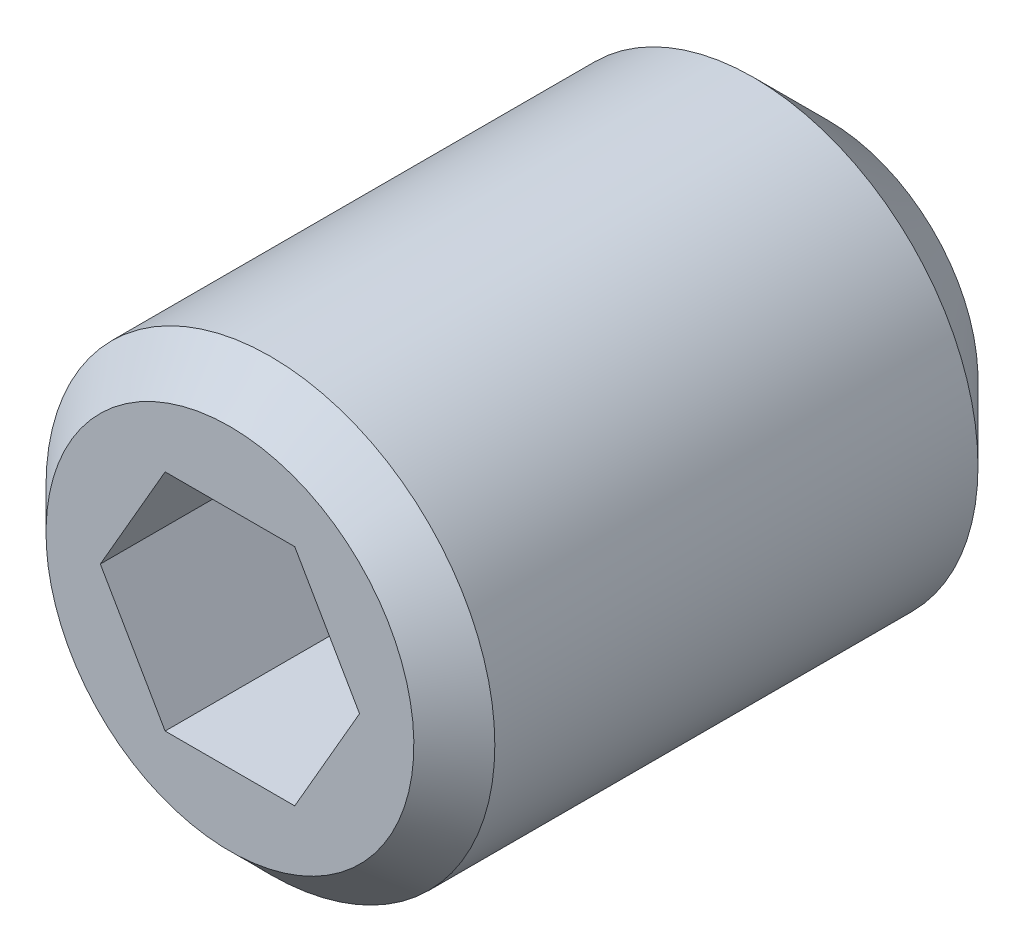
ISO-10303-21;
HEADER;
FILE_DESCRIPTION(('STEP AP214'),'2;1');
FILE_NAME('part.step','',(''),(''),'','','');
FILE_SCHEMA(('AUTOMOTIVE_DESIGN { 1 0 10303 214 1 1 1 1 }'));
ENDSEC;
DATA;
#1=APPLICATION_CONTEXT('core data for automotive mechanical design processes');
#2=APPLICATION_PROTOCOL_DEFINITION('international standard','automotive_design',2000,#1);
#3=PRODUCT_CONTEXT('',#1,'mechanical');
#4=PRODUCT('Part','Part','',(#3));
#5=PRODUCT_RELATED_PRODUCT_CATEGORY('part','',(#4));
#6=PRODUCT_DEFINITION_FORMATION('','',#4);
#7=PRODUCT_DEFINITION_CONTEXT('part definition',#1,'design');
#8=PRODUCT_DEFINITION('design','',#6,#7);
#9=PRODUCT_DEFINITION_SHAPE('','',#8);
#10=(LENGTH_UNIT() NAMED_UNIT(*) SI_UNIT(.MILLI.,.METRE.));
#11=(NAMED_UNIT(*) PLANE_ANGLE_UNIT() SI_UNIT($,.RADIAN.));
#12=(NAMED_UNIT(*) SI_UNIT($,.STERADIAN.) SOLID_ANGLE_UNIT());
#13=UNCERTAINTY_MEASURE_WITH_UNIT(LENGTH_MEASURE(1.E-05),#10,'distance_accuracy_value','');
#14=(GEOMETRIC_REPRESENTATION_CONTEXT(3) GLOBAL_UNCERTAINTY_ASSIGNED_CONTEXT((#13)) GLOBAL_UNIT_ASSIGNED_CONTEXT((#10,
#11,#12)) REPRESENTATION_CONTEXT('',''));
#15=CARTESIAN_POINT('',(0.,0.,0.));
#16=DIRECTION('',(0.,0.,1.));
#17=DIRECTION('',(1.,0.,0.));
#18=AXIS2_PLACEMENT_3D('',#15,#16,#17);
#19=CARTESIAN_POINT('',(0.,0.5,-4.));
#20=DIRECTION('',(0.,0.,-1.));
#21=DIRECTION('',(0.,1.,0.));
#22=AXIS2_PLACEMENT_3D('',#19,#20,#21);
#23=PLANE('',#22);
#24=CARTESIAN_POINT('',(0.,0.,-4.));
#25=DIRECTION('',(0.,0.,-1.));
#26=DIRECTION('',(0.,1.,0.));
#27=AXIS2_PLACEMENT_3D('',#24,#25,#26);
#28=CIRCLE('',#27,1.);
#29=CARTESIAN_POINT('',(0.,1.,-4.));
#30=VERTEX_POINT('',#29);
#31=EDGE_CURVE('E9',#30,#30,#28,.T.);
#32=ORIENTED_EDGE('',*,*,#31,.T.);
#33=EDGE_LOOP('',(#32));
#34=FACE_BOUND('',#33,.T.);
#35=ADVANCED_FACE('F15',(#34),#23,.T.);
#36=CARTESIAN_POINT('',(0.,0.,-3.75));
#37=DIRECTION('',(0.,0.,1.));
#38=DIRECTION('',(0.,1.,0.));
#39=AXIS2_PLACEMENT_3D('',#36,#37,#38);
#40=CONICAL_SURFACE('',#39,1.25,0.785398163397448);
#41=CARTESIAN_POINT('',(0.,0.,-3.5));
#42=DIRECTION('',(0.,0.,-1.));
#43=DIRECTION('',(0.,1.,0.));
#44=AXIS2_PLACEMENT_3D('',#41,#42,#43);
#45=CIRCLE('',#44,1.5);
#46=CARTESIAN_POINT('',(0.,1.5,-3.5));
#47=VERTEX_POINT('',#46);
#48=EDGE_CURVE('E22',#47,#47,#45,.T.);
#49=ORIENTED_EDGE('',*,*,#48,.T.);
#50=EDGE_LOOP('',(#49));
#51=FACE_BOUND('',#50,.T.);
#52=ORIENTED_EDGE('',*,*,#31,.F.);
#53=EDGE_LOOP('',(#52));
#54=FACE_BOUND('',#53,.T.);
#55=ADVANCED_FACE('F199',(#51,#54),#40,.T.);
#56=CARTESIAN_POINT('',(0.,0.,-1.8853125));
#57=DIRECTION('',(0.,0.,1.));
#58=DIRECTION('',(0.,1.,0.));
#59=AXIS2_PLACEMENT_3D('',#56,#57,#58);
#60=CYLINDRICAL_SURFACE('',#59,1.5);
#61=CARTESIAN_POINT('',(0.,0.,-0.270625));
#62=DIRECTION('',(0.,0.,-1.));
#63=DIRECTION('',(0.,1.,0.));
#64=AXIS2_PLACEMENT_3D('',#61,#62,#63);
#65=CIRCLE('',#64,1.5);
#66=CARTESIAN_POINT('',(0.,1.5,-0.270625));
#67=VERTEX_POINT('',#66);
#68=EDGE_CURVE('E80',#67,#67,#65,.T.);
#69=ORIENTED_EDGE('',*,*,#68,.T.);
#70=EDGE_LOOP('',(#69));
#71=FACE_BOUND('',#70,.T.);
#72=ORIENTED_EDGE('',*,*,#48,.F.);
#73=EDGE_LOOP('',(#72));
#74=FACE_BOUND('',#73,.T.);
#75=ADVANCED_FACE('F203',(#71,#74),#60,.T.);
#76=CARTESIAN_POINT('',(0.,0.,-0.1353125));
#77=DIRECTION('',(0.,0.,-1.));
#78=DIRECTION('',(0.,1.,0.));
#79=AXIS2_PLACEMENT_3D('',#76,#77,#78);
#80=CONICAL_SURFACE('',#79,1.3646875,0.785398163397448);
#81=CARTESIAN_POINT('',(0.,0.,0.));
#82=DIRECTION('',(0.,0.,-1.));
#83=DIRECTION('',(0.,1.,0.));
#84=AXIS2_PLACEMENT_3D('',#81,#82,#83);
#85=CIRCLE('',#84,1.229375);
#86=CARTESIAN_POINT('',(0.,1.229375,0.));
#87=VERTEX_POINT('',#86);
#88=EDGE_CURVE('E76',#87,#87,#85,.T.);
#89=ORIENTED_EDGE('',*,*,#88,.T.);
#90=EDGE_LOOP('',(#89));
#91=FACE_BOUND('',#90,.T.);
#92=ORIENTED_EDGE('',*,*,#68,.F.);
#93=EDGE_LOOP('',(#92));
#94=FACE_BOUND('',#93,.T.);
#95=ADVANCED_FACE('F77',(#91,#94),#80,.T.);
#96=CARTESIAN_POINT('',(0.,0.6146875,0.));
#97=DIRECTION('',(0.,0.,1.));
#98=DIRECTION('',(0.,-1.,0.));
#99=AXIS2_PLACEMENT_3D('',#96,#97,#98);
#100=PLANE('',#99);
#101=ORIENTED_EDGE('',*,*,#88,.F.);
#102=EDGE_LOOP('',(#101));
#103=FACE_BOUND('',#102,.T.);
#104=DIRECTION('',(-0.5,0.866025403784439,0.));
#105=VECTOR('',#104,1.);
#106=CARTESIAN_POINT('',(-0.782771247597187,-0.144589440514135,0.));
#107=LINE('',#106,#105);
#108=CARTESIAN_POINT('',(-0.433125,-0.75019450602827,0.));
#109=VERTEX_POINT('',#108);
#110=CARTESIAN_POINT('',(-0.86625,0.,0.));
#111=VERTEX_POINT('',#110);
#112=EDGE_CURVE('E101',#109,#111,#107,.T.);
#113=ORIENTED_EDGE('',*,*,#112,.T.);
#114=DIRECTION('',(0.5,0.866025403784439,0.));
#115=VECTOR('',#114,1.);
#116=CARTESIAN_POINT('',(-0.516603752402814,0.605605065514135,0.));
#117=LINE('',#116,#115);
#118=CARTESIAN_POINT('',(-0.433125,0.75019450602827,0.));
#119=VERTEX_POINT('',#118);
#120=EDGE_CURVE('E81',#111,#119,#117,.T.);
#121=ORIENTED_EDGE('',*,*,#120,.T.);
#122=DIRECTION('',(1.,0.,0.));
#123=VECTOR('',#122,1.);
#124=CARTESIAN_POINT('',(0.,0.75019450602827,0.));
#125=LINE('',#124,#123);
#126=CARTESIAN_POINT('',(0.433125,0.75019450602827,0.));
#127=VERTEX_POINT('',#126);
#128=EDGE_CURVE('E88',#119,#127,#125,.T.);
#129=ORIENTED_EDGE('',*,*,#128,.T.);
#130=DIRECTION('',(0.5,-0.866025403784439,0.));
#131=VECTOR('',#130,1.);
#132=CARTESIAN_POINT('',(0.516603752402813,0.605605065514135,0.));
#133=LINE('',#132,#131);
#134=CARTESIAN_POINT('',(0.86625,0.,0.));
#135=VERTEX_POINT('',#134);
#136=EDGE_CURVE('E91',#127,#135,#133,.T.);
#137=ORIENTED_EDGE('',*,*,#136,.T.);
#138=DIRECTION('',(-0.5,-0.866025403784439,0.));
#139=VECTOR('',#138,1.);
#140=CARTESIAN_POINT('',(0.782771247597187,-0.144589440514135,0.));
#141=LINE('',#140,#139);
#142=CARTESIAN_POINT('',(0.433125,-0.75019450602827,0.));
#143=VERTEX_POINT('',#142);
#144=EDGE_CURVE('E95',#135,#143,#141,.T.);
#145=ORIENTED_EDGE('',*,*,#144,.T.);
#146=DIRECTION('',(-1.,0.,0.));
#147=VECTOR('',#146,1.);
#148=CARTESIAN_POINT('',(0.,-0.75019450602827,0.));
#149=LINE('',#148,#147);
#150=EDGE_CURVE('E100',#143,#109,#149,.T.);
#151=ORIENTED_EDGE('',*,*,#150,.T.);
#152=EDGE_LOOP('',(#113,#121,#129,#137,#145,#151));
#153=FACE_BOUND('',#152,.T.);
#154=ADVANCED_FACE('F159',(#103,#153),#100,.T.);
#155=CARTESIAN_POINT('',(-0.6496875,0.375097253014135,0.));
#156=DIRECTION('',(-0.866025403784439,0.5,0.));
#157=DIRECTION('',(0.5,0.866025403784439,0.));
#158=AXIS2_PLACEMENT_3D('',#155,#156,#157);
#159=PLANE('',#158);
#160=CARTESIAN_POINT('',(-0.86625,0.,-2.));
#161=CARTESIAN_POINT('',(-0.6496875,0.375097253014132,-2.12503241767138));
#162=CARTESIAN_POINT('',(-0.433125,0.75019450602827,-2.));
#163=(BOUNDED_CURVE() B_SPLINE_CURVE(2,(#160,#161,#162),.UNSPECIFIED.,.F.,
.F.) B_SPLINE_CURVE_WITH_KNOTS((3,3),(0.,0.876554371430944),
.UNSPECIFIED.) CURVE() GEOMETRIC_REPRESENTATION_ITEM() RATIONAL_B_SPLINE_CURVE((1.,
1.15470053837926,1.)) REPRESENTATION_ITEM(''));
#164=CARTESIAN_POINT('',(-0.86625,0.,-2.));
#165=VERTEX_POINT('',#164);
#166=CARTESIAN_POINT('',(-0.433125,0.75019450602827,-2.));
#167=VERTEX_POINT('',#166);
#168=EDGE_CURVE('E119',#165,#167,#163,.T.);
#169=ORIENTED_EDGE('',*,*,#168,.T.);
#170=DIRECTION('',(0.,0.,-1.));
#171=VECTOR('',#170,1.);
#172=CARTESIAN_POINT('',(-0.433125,0.75019450602827,0.));
#173=LINE('',#172,#171);
#174=EDGE_CURVE('E84',#119,#167,#173,.T.);
#175=ORIENTED_EDGE('',*,*,#174,.F.);
#176=ORIENTED_EDGE('',*,*,#120,.F.);
#177=DIRECTION('',(0.,0.,-1.));
#178=VECTOR('',#177,1.);
#179=CARTESIAN_POINT('',(-0.86625,0.,0.));
#180=LINE('',#179,#178);
#181=EDGE_CURVE('E103',#111,#165,#180,.T.);
#182=ORIENTED_EDGE('',*,*,#181,.T.);
#183=EDGE_LOOP('',(#169,#175,#176,#182));
#184=FACE_BOUND('',#183,.T.);
#185=ADVANCED_FACE('F168',(#184),#159,.F.);
#186=CARTESIAN_POINT('',(0.,0.75019450602827,0.));
#187=DIRECTION('',(0.,1.,0.));
#188=DIRECTION('',(1.,0.,0.));
#189=AXIS2_PLACEMENT_3D('',#186,#187,#188);
#190=PLANE('',#189);
#191=CARTESIAN_POINT('',(-0.433125,0.75019450602827,-2.));
#192=CARTESIAN_POINT('',(0.,0.75019450602827,-2.12503241767138));
#193=CARTESIAN_POINT('',(0.433125,0.75019450602827,-2.));
#194=(BOUNDED_CURVE() B_SPLINE_CURVE(2,(#191,#192,#193),.UNSPECIFIED.,.F.,
.F.) B_SPLINE_CURVE_WITH_KNOTS((3,3),(0.,0.876554371430946),
.UNSPECIFIED.) CURVE() GEOMETRIC_REPRESENTATION_ITEM() RATIONAL_B_SPLINE_CURVE((1.,
1.15470053837925,1.)) REPRESENTATION_ITEM(''));
#195=CARTESIAN_POINT('',(0.433125,0.75019450602827,-2.));
#196=VERTEX_POINT('',#195);
#197=EDGE_CURVE('E128',#167,#196,#194,.T.);
#198=ORIENTED_EDGE('',*,*,#197,.T.);
#199=DIRECTION('',(0.,0.,-1.));
#200=VECTOR('',#199,1.);
#201=CARTESIAN_POINT('',(0.433125,0.75019450602827,0.));
#202=LINE('',#201,#200);
#203=EDGE_CURVE('E89',#127,#196,#202,.T.);
#204=ORIENTED_EDGE('',*,*,#203,.F.);
#205=ORIENTED_EDGE('',*,*,#128,.F.);
#206=ORIENTED_EDGE('',*,*,#174,.T.);
#207=EDGE_LOOP('',(#198,#204,#205,#206));
#208=FACE_BOUND('',#207,.T.);
#209=ADVANCED_FACE('F173',(#208),#190,.F.);
#210=CARTESIAN_POINT('',(0.6496875,0.375097253014135,0.));
#211=DIRECTION('',(0.866025403784439,0.5,0.));
#212=DIRECTION('',(0.5,-0.866025403784439,0.));
#213=AXIS2_PLACEMENT_3D('',#210,#211,#212);
#214=PLANE('',#213);
#215=CARTESIAN_POINT('',(0.433125,0.750194506028271,-2.));
#216=CARTESIAN_POINT('',(0.649687500000001,0.375097253014135,-2.12503241767138));
#217=CARTESIAN_POINT('',(0.86625,0.,-2.));
#218=(BOUNDED_CURVE() B_SPLINE_CURVE(2,(#215,#216,#217),.UNSPECIFIED.,.F.,
.F.) B_SPLINE_CURVE_WITH_KNOTS((3,3),(0.,0.876554371430945),
.UNSPECIFIED.) CURVE() GEOMETRIC_REPRESENTATION_ITEM() RATIONAL_B_SPLINE_CURVE((1.,
1.15470053837925,1.)) REPRESENTATION_ITEM(''));
#219=CARTESIAN_POINT('',(0.86625,0.,-2.));
#220=VERTEX_POINT('',#219);
#221=EDGE_CURVE('E137',#196,#220,#218,.T.);
#222=ORIENTED_EDGE('',*,*,#221,.T.);
#223=DIRECTION('',(0.,0.,-1.));
#224=VECTOR('',#223,1.);
#225=CARTESIAN_POINT('',(0.86625,0.,0.));
#226=LINE('',#225,#224);
#227=EDGE_CURVE('E93',#135,#220,#226,.T.);
#228=ORIENTED_EDGE('',*,*,#227,.F.);
#229=ORIENTED_EDGE('',*,*,#136,.F.);
#230=ORIENTED_EDGE('',*,*,#203,.T.);
#231=EDGE_LOOP('',(#222,#228,#229,#230));
#232=FACE_BOUND('',#231,.T.);
#233=ADVANCED_FACE('F179',(#232),#214,.F.);
#234=CARTESIAN_POINT('',(0.6496875,-0.375097253014135,0.));
#235=DIRECTION('',(0.866025403784439,-0.5,0.));
#236=DIRECTION('',(-0.5,-0.866025403784439,0.));
#237=AXIS2_PLACEMENT_3D('',#234,#235,#236);
#238=PLANE('',#237);
#239=CARTESIAN_POINT('',(0.86625,0.,-2.));
#240=CARTESIAN_POINT('',(0.649687500000001,-0.375097253014135,-2.12503241767138));
#241=CARTESIAN_POINT('',(0.433125,-0.750194506028271,-2.));
#242=(BOUNDED_CURVE() B_SPLINE_CURVE(2,(#239,#240,#241),.UNSPECIFIED.,.F.,
.F.) B_SPLINE_CURVE_WITH_KNOTS((3,3),(0.,0.876554371430945),
.UNSPECIFIED.) CURVE() GEOMETRIC_REPRESENTATION_ITEM() RATIONAL_B_SPLINE_CURVE((1.,
1.15470053837925,1.)) REPRESENTATION_ITEM(''));
#243=CARTESIAN_POINT('',(0.433125,-0.75019450602827,-2.));
#244=VERTEX_POINT('',#243);
#245=EDGE_CURVE('E105',#220,#244,#242,.T.);
#246=ORIENTED_EDGE('',*,*,#245,.T.);
#247=DIRECTION('',(0.,0.,-1.));
#248=VECTOR('',#247,1.);
#249=CARTESIAN_POINT('',(0.433125,-0.75019450602827,0.));
#250=LINE('',#249,#248);
#251=EDGE_CURVE('E97',#143,#244,#250,.T.);
#252=ORIENTED_EDGE('',*,*,#251,.F.);
#253=ORIENTED_EDGE('',*,*,#144,.F.);
#254=ORIENTED_EDGE('',*,*,#227,.T.);
#255=EDGE_LOOP('',(#246,#252,#253,#254));
#256=FACE_BOUND('',#255,.T.);
#257=ADVANCED_FACE('F183',(#256),#238,.F.);
#258=CARTESIAN_POINT('',(0.,-0.75019450602827,0.));
#259=DIRECTION('',(0.,-1.,0.));
#260=DIRECTION('',(-1.,0.,0.));
#261=AXIS2_PLACEMENT_3D('',#258,#259,#260);
#262=PLANE('',#261);
#263=CARTESIAN_POINT('',(0.433125,-0.75019450602827,-2.));
#264=CARTESIAN_POINT('',(0.,-0.75019450602827,-2.12503241767138));
#265=CARTESIAN_POINT('',(-0.433125,-0.75019450602827,-2.));
#266=(BOUNDED_CURVE() B_SPLINE_CURVE(2,(#263,#264,#265),.UNSPECIFIED.,.F.,
.F.) B_SPLINE_CURVE_WITH_KNOTS((3,3),(0.,0.876554371430945),
.UNSPECIFIED.) CURVE() GEOMETRIC_REPRESENTATION_ITEM() RATIONAL_B_SPLINE_CURVE((1.,
1.15470053837925,1.)) REPRESENTATION_ITEM(''));
#267=CARTESIAN_POINT('',(-0.433125,-0.75019450602827,-2.));
#268=VERTEX_POINT('',#267);
#269=EDGE_CURVE('E106',#244,#268,#266,.T.);
#270=ORIENTED_EDGE('',*,*,#269,.T.);
#271=DIRECTION('',(0.,0.,-1.));
#272=VECTOR('',#271,1.);
#273=CARTESIAN_POINT('',(-0.433125,-0.75019450602827,0.));
#274=LINE('',#273,#272);
#275=EDGE_CURVE('E98',#109,#268,#274,.T.);
#276=ORIENTED_EDGE('',*,*,#275,.F.);
#277=ORIENTED_EDGE('',*,*,#150,.F.);
#278=ORIENTED_EDGE('',*,*,#251,.T.);
#279=EDGE_LOOP('',(#270,#276,#277,#278));
#280=FACE_BOUND('',#279,.T.);
#281=ADVANCED_FACE('F186',(#280),#262,.F.);
#282=CARTESIAN_POINT('',(-0.6496875,-0.375097253014135,0.));
#283=DIRECTION('',(-0.866025403784439,-0.5,0.));
#284=DIRECTION('',(-0.5,0.866025403784439,0.));
#285=AXIS2_PLACEMENT_3D('',#282,#283,#284);
#286=PLANE('',#285);
#287=CARTESIAN_POINT('',(-0.433125,-0.750194506028271,-2.));
#288=CARTESIAN_POINT('',(-0.649687500000001,-0.375097253014135,-2.12503241767138));
#289=CARTESIAN_POINT('',(-0.86625,0.,-2.));
#290=(BOUNDED_CURVE() B_SPLINE_CURVE(2,(#287,#288,#289),.UNSPECIFIED.,.F.,
.F.) B_SPLINE_CURVE_WITH_KNOTS((3,3),(0.,0.876554371430945),
.UNSPECIFIED.) CURVE() GEOMETRIC_REPRESENTATION_ITEM() RATIONAL_B_SPLINE_CURVE((1.,
1.15470053837925,1.)) REPRESENTATION_ITEM(''));
#291=EDGE_CURVE('E111',#268,#165,#290,.T.);
#292=ORIENTED_EDGE('',*,*,#291,.T.);
#293=ORIENTED_EDGE('',*,*,#181,.F.);
#294=ORIENTED_EDGE('',*,*,#112,.F.);
#295=ORIENTED_EDGE('',*,*,#275,.T.);
#296=EDGE_LOOP('',(#292,#293,#294,#295));
#297=FACE_BOUND('',#296,.T.);
#298=ADVANCED_FACE('F164',(#297),#286,.F.);
#299=CARTESIAN_POINT('',(0.,0.,-2.25006483534276));
#300=DIRECTION('',(0.,0.,1.));
#301=DIRECTION('',(0.,1.,0.));
#302=AXIS2_PLACEMENT_3D('',#299,#300,#301);
#303=CONICAL_SURFACE('',#302,0.433125,1.0471975511966);
#304=CARTESIAN_POINT('',(0.,0.,-2.50012967068552));
#305=VERTEX_POINT('',#304);
#306=VERTEX_LOOP('',#305);
#307=FACE_BOUND('',#306,.T.);
#308=ORIENTED_EDGE('',*,*,#221,.F.);
#309=ORIENTED_EDGE('',*,*,#197,.F.);
#310=ORIENTED_EDGE('',*,*,#168,.F.);
#311=ORIENTED_EDGE('',*,*,#291,.F.);
#312=ORIENTED_EDGE('',*,*,#269,.F.);
#313=ORIENTED_EDGE('',*,*,#245,.F.);
#314=EDGE_LOOP('',(#308,#309,#310,#311,#312,#313));
#315=FACE_BOUND('',#314,.T.);
#316=ADVANCED_FACE('F188',(#307,#315),#303,.F.);
#317=CLOSED_SHELL('',(#35,#55,#75,#95,#154,#185,#209,#233,#257,#281,#298,#316));
#318=MANIFOLD_SOLID_BREP('B1',#317);
#319=ADVANCED_BREP_SHAPE_REPRESENTATION('',(#18,#318),#14);
#320=SHAPE_DEFINITION_REPRESENTATION(#9,#319);
ENDSEC;
END-ISO-10303-21;
